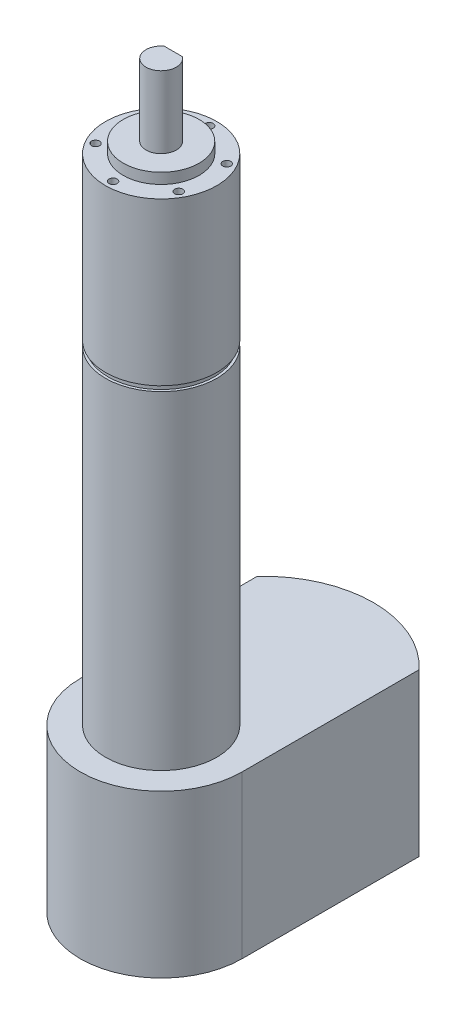
ISO-10303-21;
HEADER;
FILE_DESCRIPTION(('STEP AP214'),'2;1');
FILE_NAME('part.step','',(''),(''),'','','');
FILE_SCHEMA(('AUTOMOTIVE_DESIGN { 1 0 10303 214 1 1 1 1 }'));
ENDSEC;
DATA;
#1=APPLICATION_CONTEXT('core data for automotive mechanical design processes');
#2=APPLICATION_PROTOCOL_DEFINITION('international standard','automotive_design',2000,#1);
#3=PRODUCT_CONTEXT('',#1,'mechanical');
#4=PRODUCT('Part','Part','',(#3));
#5=PRODUCT_RELATED_PRODUCT_CATEGORY('part','',(#4));
#6=PRODUCT_DEFINITION_FORMATION('','',#4);
#7=PRODUCT_DEFINITION_CONTEXT('part definition',#1,'design');
#8=PRODUCT_DEFINITION('design','',#6,#7);
#9=PRODUCT_DEFINITION_SHAPE('','',#8);
#10=(LENGTH_UNIT() NAMED_UNIT(*) SI_UNIT(.MILLI.,.METRE.));
#11=(NAMED_UNIT(*) PLANE_ANGLE_UNIT() SI_UNIT($,.RADIAN.));
#12=(NAMED_UNIT(*) SI_UNIT($,.STERADIAN.) SOLID_ANGLE_UNIT());
#13=UNCERTAINTY_MEASURE_WITH_UNIT(LENGTH_MEASURE(1.E-05),#10,'distance_accuracy_value','');
#14=(GEOMETRIC_REPRESENTATION_CONTEXT(3) GLOBAL_UNCERTAINTY_ASSIGNED_CONTEXT((#13)) GLOBAL_UNIT_ASSIGNED_CONTEXT((#10,
#11,#12)) REPRESENTATION_CONTEXT('',''));
#15=CARTESIAN_POINT('',(0.,0.,0.));
#16=DIRECTION('',(0.,0.,1.));
#17=DIRECTION('',(1.,0.,0.));
#18=AXIS2_PLACEMENT_3D('',#15,#16,#17);
#19=CARTESIAN_POINT('',(11.,64.9,0.));
#20=DIRECTION('',(0.,-1.,0.));
#21=DIRECTION('',(0.,0.,-1.));
#22=AXIS2_PLACEMENT_3D('',#19,#20,#21);
#23=PLANE('',#22);
#24=CARTESIAN_POINT('',(0.,64.9,0.));
#25=DIRECTION('',(0.,1.,0.));
#26=DIRECTION('',(0.,0.,1.));
#27=AXIS2_PLACEMENT_3D('',#24,#25,#26);
#28=CIRCLE('',#27,10.5);
#29=CARTESIAN_POINT('',(0.,64.9,10.5));
#30=VERTEX_POINT('',#29);
#31=EDGE_CURVE('E203',#30,#30,#28,.T.);
#32=ORIENTED_EDGE('',*,*,#31,.F.);
#33=EDGE_LOOP('',(#32));
#34=FACE_BOUND('',#33,.T.);
#35=CARTESIAN_POINT('',(0.,64.9,0.));
#36=DIRECTION('',(0.,1.,0.));
#37=DIRECTION('',(0.,0.,1.));
#38=AXIS2_PLACEMENT_3D('',#35,#36,#37);
#39=CIRCLE('',#38,11.);
#40=CARTESIAN_POINT('',(0.,64.9,11.));
#41=VERTEX_POINT('',#40);
#42=EDGE_CURVE('E11',#41,#41,#39,.T.);
#43=ORIENTED_EDGE('',*,*,#42,.T.);
#44=EDGE_LOOP('',(#43));
#45=FACE_BOUND('',#44,.T.);
#46=ADVANCED_FACE('F40',(#34,#45),#23,.F.);
#47=CARTESIAN_POINT('',(0.,60.6506719839022,0.));
#48=DIRECTION('',(0.,1.,0.));
#49=DIRECTION('',(0.,0.,1.));
#50=AXIS2_PLACEMENT_3D('',#47,#48,#49);
#51=CYLINDRICAL_SURFACE('',#50,11.);
#52=ORIENTED_EDGE('',*,*,#42,.F.);
#53=EDGE_LOOP('',(#52));
#54=FACE_BOUND('',#53,.T.);
#55=CARTESIAN_POINT('',(0.,0.,0.));
#56=DIRECTION('',(0.,1.,0.));
#57=DIRECTION('',(0.,0.,1.));
#58=AXIS2_PLACEMENT_3D('',#55,#56,#57);
#59=CIRCLE('',#58,11.);
#60=CARTESIAN_POINT('',(0.,0.,11.));
#61=VERTEX_POINT('',#60);
#62=EDGE_CURVE('E195',#61,#61,#59,.T.);
#63=ORIENTED_EDGE('',*,*,#62,.T.);
#64=EDGE_LOOP('',(#63));
#65=FACE_BOUND('',#64,.T.);
#66=ADVANCED_FACE('F229',(#54,#65),#51,.T.);
#67=CARTESIAN_POINT('',(3.,114.2,0.));
#68=DIRECTION('',(0.,-1.,0.));
#69=DIRECTION('',(0.,0.,-1.));
#70=AXIS2_PLACEMENT_3D('',#67,#68,#69);
#71=PLANE('',#70);
#72=CARTESIAN_POINT('',(0.,114.2,0.));
#73=DIRECTION('',(0.,1.,0.));
#74=DIRECTION('',(0.,0.,1.));
#75=AXIS2_PLACEMENT_3D('',#72,#73,#74);
#76=CIRCLE('',#75,3.);
#77=CARTESIAN_POINT('',(-1.79999999999998,114.2,-2.40000000000001));
#78=VERTEX_POINT('',#77);
#79=CARTESIAN_POINT('',(1.79999999999998,114.2,-2.40000000000001));
#80=VERTEX_POINT('',#79);
#81=EDGE_CURVE('E47',#78,#80,#76,.T.);
#82=ORIENTED_EDGE('',*,*,#81,.T.);
#83=DIRECTION('',(1.,0.,0.));
#84=VECTOR('',#83,1.);
#85=CARTESIAN_POINT('',(0.,114.2,-2.40000000000001));
#86=LINE('',#85,#84);
#87=EDGE_CURVE('E197',#78,#80,#86,.T.);
#88=ORIENTED_EDGE('',*,*,#87,.F.);
#89=EDGE_LOOP('',(#82,#88));
#90=FACE_BOUND('',#89,.T.);
#91=ADVANCED_FACE('F260',(#90),#71,.F.);
#92=CARTESIAN_POINT('',(0.,60.6506719839022,0.));
#93=DIRECTION('',(0.,1.,0.));
#94=DIRECTION('',(0.,0.,1.));
#95=AXIS2_PLACEMENT_3D('',#92,#93,#94);
#96=CYLINDRICAL_SURFACE('',#95,3.);
#97=CARTESIAN_POINT('',(0.,104.,0.));
#98=DIRECTION('',(0.,1.,0.));
#99=DIRECTION('',(0.,0.,1.));
#100=AXIS2_PLACEMENT_3D('',#97,#98,#99);
#101=CIRCLE('',#100,3.);
#102=CARTESIAN_POINT('',(1.79999999999999,104.,-2.40000000000001));
#103=VERTEX_POINT('',#102);
#104=CARTESIAN_POINT('',(-1.79999999999998,104.,-2.40000000000001));
#105=VERTEX_POINT('',#104);
#106=EDGE_CURVE('E58',#103,#105,#101,.T.);
#107=ORIENTED_EDGE('',*,*,#106,.F.);
#108=DIRECTION('',(0.,1.,0.));
#109=VECTOR('',#108,1.);
#110=CARTESIAN_POINT('',(1.79999999999998,104.,-2.40000000000001));
#111=LINE('',#110,#109);
#112=EDGE_CURVE('E200',#103,#80,#111,.T.);
#113=ORIENTED_EDGE('',*,*,#112,.T.);
#114=ORIENTED_EDGE('',*,*,#81,.F.);
#115=DIRECTION('',(0.,1.,0.));
#116=VECTOR('',#115,1.);
#117=CARTESIAN_POINT('',(-1.79999999999998,104.,-2.40000000000001));
#118=LINE('',#117,#116);
#119=EDGE_CURVE('E69',#105,#78,#118,.T.);
#120=ORIENTED_EDGE('',*,*,#119,.F.);
#121=EDGE_LOOP('',(#107,#113,#114,#120));
#122=FACE_BOUND('',#121,.T.);
#123=CARTESIAN_POINT('',(0.,100.,0.));
#124=DIRECTION('',(0.,1.,0.));
#125=DIRECTION('',(0.,0.,1.));
#126=AXIS2_PLACEMENT_3D('',#123,#124,#125);
#127=CIRCLE('',#126,3.);
#128=CARTESIAN_POINT('',(0.,100.,3.));
#129=VERTEX_POINT('',#128);
#130=EDGE_CURVE('E222',#129,#129,#127,.T.);
#131=ORIENTED_EDGE('',*,*,#130,.T.);
#132=EDGE_LOOP('',(#131));
#133=FACE_BOUND('',#132,.T.);
#134=ADVANCED_FACE('F297',(#122,#133),#96,.T.);
#135=CARTESIAN_POINT('',(7.5,100.,0.));
#136=DIRECTION('',(0.,-1.,0.));
#137=DIRECTION('',(0.,0.,-1.));
#138=AXIS2_PLACEMENT_3D('',#135,#136,#137);
#139=PLANE('',#138);
#140=ORIENTED_EDGE('',*,*,#130,.F.);
#141=EDGE_LOOP('',(#140));
#142=FACE_BOUND('',#141,.T.);
#143=CARTESIAN_POINT('',(0.,100.,0.));
#144=DIRECTION('',(0.,1.,0.));
#145=DIRECTION('',(0.,0.,1.));
#146=AXIS2_PLACEMENT_3D('',#143,#144,#145);
#147=CIRCLE('',#146,7.5);
#148=CARTESIAN_POINT('',(0.,100.,7.5));
#149=VERTEX_POINT('',#148);
#150=EDGE_CURVE('E219',#149,#149,#147,.T.);
#151=ORIENTED_EDGE('',*,*,#150,.T.);
#152=EDGE_LOOP('',(#151));
#153=FACE_BOUND('',#152,.T.);
#154=ADVANCED_FACE('F293',(#142,#153),#139,.F.);
#155=CARTESIAN_POINT('',(0.,60.6506719839022,0.));
#156=DIRECTION('',(0.,1.,0.));
#157=DIRECTION('',(0.,0.,1.));
#158=AXIS2_PLACEMENT_3D('',#155,#156,#157);
#159=CYLINDRICAL_SURFACE('',#158,7.5);
#160=ORIENTED_EDGE('',*,*,#150,.F.);
#161=EDGE_LOOP('',(#160));
#162=FACE_BOUND('',#161,.T.);
#163=CARTESIAN_POINT('',(0.,97.9,0.));
#164=DIRECTION('',(0.,1.,0.));
#165=DIRECTION('',(0.,0.,1.));
#166=AXIS2_PLACEMENT_3D('',#163,#164,#165);
#167=CIRCLE('',#166,7.5);
#168=CARTESIAN_POINT('',(0.,97.9,7.5));
#169=VERTEX_POINT('',#168);
#170=EDGE_CURVE('E216',#169,#169,#167,.T.);
#171=ORIENTED_EDGE('',*,*,#170,.T.);
#172=EDGE_LOOP('',(#171));
#173=FACE_BOUND('',#172,.T.);
#174=ADVANCED_FACE('F289',(#162,#173),#159,.T.);
#175=CARTESIAN_POINT('',(11.,97.9,0.));
#176=DIRECTION('',(0.,-1.,0.));
#177=DIRECTION('',(0.,0.,-1.));
#178=AXIS2_PLACEMENT_3D('',#175,#176,#177);
#179=PLANE('',#178);
#180=CARTESIAN_POINT('',(0.,97.9,-9.5));
#181=DIRECTION('',(0.,1.,0.));
#182=DIRECTION('',(0.,0.,1.));
#183=AXIS2_PLACEMENT_3D('',#180,#181,#182);
#184=CIRCLE('',#183,0.799999999999999);
#185=CARTESIAN_POINT('',(0.,97.9,-8.7));
#186=VERTEX_POINT('',#185);
#187=EDGE_CURVE('E140',#186,#186,#184,.T.);
#188=ORIENTED_EDGE('',*,*,#187,.F.);
#189=EDGE_LOOP('',(#188));
#190=FACE_BOUND('',#189,.T.);
#191=CARTESIAN_POINT('',(-8.22724133595217,97.9,-4.75));
#192=DIRECTION('',(0.,1.,0.));
#193=DIRECTION('',(0.,0.,1.));
#194=AXIS2_PLACEMENT_3D('',#191,#192,#193);
#195=CIRCLE('',#194,0.799999999999999);
#196=CARTESIAN_POINT('',(-8.22724133595217,97.9,-3.95));
#197=VERTEX_POINT('',#196);
#198=EDGE_CURVE('E139',#197,#197,#195,.T.);
#199=ORIENTED_EDGE('',*,*,#198,.F.);
#200=EDGE_LOOP('',(#199));
#201=FACE_BOUND('',#200,.T.);
#202=CARTESIAN_POINT('',(-8.22724133595217,97.9,4.75));
#203=DIRECTION('',(0.,1.,0.));
#204=DIRECTION('',(0.,0.,1.));
#205=AXIS2_PLACEMENT_3D('',#202,#203,#204);
#206=CIRCLE('',#205,0.799999999999999);
#207=CARTESIAN_POINT('',(-8.22724133595217,97.9,5.55));
#208=VERTEX_POINT('',#207);
#209=EDGE_CURVE('E150',#208,#208,#206,.T.);
#210=ORIENTED_EDGE('',*,*,#209,.F.);
#211=EDGE_LOOP('',(#210));
#212=FACE_BOUND('',#211,.T.);
#213=CARTESIAN_POINT('',(0.,97.9,9.5));
#214=DIRECTION('',(0.,1.,0.));
#215=DIRECTION('',(0.,0.,1.));
#216=AXIS2_PLACEMENT_3D('',#213,#214,#215);
#217=CIRCLE('',#216,0.799999999999999);
#218=CARTESIAN_POINT('',(0.,97.9,10.3));
#219=VERTEX_POINT('',#218);
#220=EDGE_CURVE('E156',#219,#219,#217,.T.);
#221=ORIENTED_EDGE('',*,*,#220,.F.);
#222=EDGE_LOOP('',(#221));
#223=FACE_BOUND('',#222,.T.);
#224=CARTESIAN_POINT('',(8.22724133595217,97.9,4.75));
#225=DIRECTION('',(0.,1.,0.));
#226=DIRECTION('',(0.,0.,1.));
#227=AXIS2_PLACEMENT_3D('',#224,#225,#226);
#228=CIRCLE('',#227,0.799999999999999);
#229=CARTESIAN_POINT('',(8.22724133595217,97.9,5.55));
#230=VERTEX_POINT('',#229);
#231=EDGE_CURVE('E162',#230,#230,#228,.T.);
#232=ORIENTED_EDGE('',*,*,#231,.F.);
#233=EDGE_LOOP('',(#232));
#234=FACE_BOUND('',#233,.T.);
#235=CARTESIAN_POINT('',(8.22724133595217,97.9,-4.75));
#236=DIRECTION('',(0.,1.,0.));
#237=DIRECTION('',(0.,0.,1.));
#238=AXIS2_PLACEMENT_3D('',#235,#236,#237);
#239=CIRCLE('',#238,0.799999999999999);
#240=CARTESIAN_POINT('',(8.22724133595217,97.9,-3.95));
#241=VERTEX_POINT('',#240);
#242=EDGE_CURVE('E168',#241,#241,#239,.T.);
#243=ORIENTED_EDGE('',*,*,#242,.F.);
#244=EDGE_LOOP('',(#243));
#245=FACE_BOUND('',#244,.T.);
#246=ORIENTED_EDGE('',*,*,#170,.F.);
#247=EDGE_LOOP('',(#246));
#248=FACE_BOUND('',#247,.T.);
#249=CARTESIAN_POINT('',(0.,97.9,0.));
#250=DIRECTION('',(0.,1.,0.));
#251=DIRECTION('',(0.,0.,1.));
#252=AXIS2_PLACEMENT_3D('',#249,#250,#251);
#253=CIRCLE('',#252,11.);
#254=CARTESIAN_POINT('',(0.,97.9,11.));
#255=VERTEX_POINT('',#254);
#256=EDGE_CURVE('E213',#255,#255,#253,.T.);
#257=ORIENTED_EDGE('',*,*,#256,.T.);
#258=EDGE_LOOP('',(#257));
#259=FACE_BOUND('',#258,.T.);
#260=ADVANCED_FACE('F285',(#190,#201,#212,#223,#234,#245,#248,#259),#179,.F.);
#261=CARTESIAN_POINT('',(0.,60.6506719839022,0.));
#262=DIRECTION('',(0.,1.,0.));
#263=DIRECTION('',(0.,0.,1.));
#264=AXIS2_PLACEMENT_3D('',#261,#262,#263);
#265=CYLINDRICAL_SURFACE('',#264,11.);
#266=ORIENTED_EDGE('',*,*,#256,.F.);
#267=EDGE_LOOP('',(#266));
#268=FACE_BOUND('',#267,.T.);
#269=CARTESIAN_POINT('',(0.,65.9,0.));
#270=DIRECTION('',(0.,1.,0.));
#271=DIRECTION('',(0.,0.,1.));
#272=AXIS2_PLACEMENT_3D('',#269,#270,#271);
#273=CIRCLE('',#272,11.);
#274=CARTESIAN_POINT('',(0.,65.9,11.));
#275=VERTEX_POINT('',#274);
#276=EDGE_CURVE('E210',#275,#275,#273,.T.);
#277=ORIENTED_EDGE('',*,*,#276,.T.);
#278=EDGE_LOOP('',(#277));
#279=FACE_BOUND('',#278,.T.);
#280=ADVANCED_FACE('F277',(#268,#279),#265,.T.);
#281=CARTESIAN_POINT('',(10.5,65.9,0.));
#282=DIRECTION('',(0.,1.,0.));
#283=DIRECTION('',(0.,0.,1.));
#284=AXIS2_PLACEMENT_3D('',#281,#282,#283);
#285=PLANE('',#284);
#286=ORIENTED_EDGE('',*,*,#276,.F.);
#287=EDGE_LOOP('',(#286));
#288=FACE_BOUND('',#287,.T.);
#289=CARTESIAN_POINT('',(0.,65.9,0.));
#290=DIRECTION('',(0.,1.,0.));
#291=DIRECTION('',(0.,0.,1.));
#292=AXIS2_PLACEMENT_3D('',#289,#290,#291);
#293=CIRCLE('',#292,10.5);
#294=CARTESIAN_POINT('',(0.,65.9,10.5));
#295=VERTEX_POINT('',#294);
#296=EDGE_CURVE('E207',#295,#295,#293,.T.);
#297=ORIENTED_EDGE('',*,*,#296,.T.);
#298=EDGE_LOOP('',(#297));
#299=FACE_BOUND('',#298,.T.);
#300=ADVANCED_FACE('F269',(#288,#299),#285,.F.);
#301=CARTESIAN_POINT('',(0.,60.6506719839022,0.));
#302=DIRECTION('',(0.,1.,0.));
#303=DIRECTION('',(0.,0.,1.));
#304=AXIS2_PLACEMENT_3D('',#301,#302,#303);
#305=CYLINDRICAL_SURFACE('',#304,10.5);
#306=ORIENTED_EDGE('',*,*,#296,.F.);
#307=EDGE_LOOP('',(#306));
#308=FACE_BOUND('',#307,.T.);
#309=ORIENTED_EDGE('',*,*,#31,.T.);
#310=EDGE_LOOP('',(#309));
#311=FACE_BOUND('',#310,.T.);
#312=ADVANCED_FACE('F266',(#308,#311),#305,.T.);
#313=CARTESIAN_POINT('',(0.,104.,-2.40000000000001));
#314=DIRECTION('',(0.,0.,1.));
#315=DIRECTION('',(1.,0.,0.));
#316=AXIS2_PLACEMENT_3D('',#313,#314,#315);
#317=PLANE('',#316);
#318=ORIENTED_EDGE('',*,*,#87,.T.);
#319=ORIENTED_EDGE('',*,*,#112,.F.);
#320=DIRECTION('',(1.,0.,0.));
#321=VECTOR('',#320,1.);
#322=CARTESIAN_POINT('',(0.,104.,-2.40000000000001));
#323=LINE('',#322,#321);
#324=EDGE_CURVE('E53',#105,#103,#323,.T.);
#325=ORIENTED_EDGE('',*,*,#324,.F.);
#326=ORIENTED_EDGE('',*,*,#119,.T.);
#327=EDGE_LOOP('',(#318,#319,#325,#326));
#328=FACE_BOUND('',#327,.T.);
#329=ADVANCED_FACE('F268',(#328),#317,.F.);
#330=CARTESIAN_POINT('',(0.,104.,0.));
#331=DIRECTION('',(0.,1.,0.));
#332=DIRECTION('',(0.,0.,1.));
#333=AXIS2_PLACEMENT_3D('',#330,#331,#332);
#334=PLANE('',#333);
#335=ORIENTED_EDGE('',*,*,#106,.T.);
#336=ORIENTED_EDGE('',*,*,#324,.T.);
#337=EDGE_LOOP('',(#335,#336));
#338=FACE_BOUND('',#337,.T.);
#339=ADVANCED_FACE('F253',(#338),#334,.T.);
#340=CARTESIAN_POINT('',(0.,-32.,0.));
#341=DIRECTION('',(0.,1.,0.));
#342=DIRECTION('',(0.,0.,1.));
#343=AXIS2_PLACEMENT_3D('',#340,#341,#342);
#344=CYLINDRICAL_SURFACE('',#343,16.);
#345=CARTESIAN_POINT('',(0.,0.,0.));
#346=DIRECTION('',(0.,-1.,0.));
#347=DIRECTION('',(0.,0.,-1.));
#348=AXIS2_PLACEMENT_3D('',#345,#346,#347);
#349=CIRCLE('',#348,16.);
#350=CARTESIAN_POINT('',(16.,0.,0.));
#351=VERTEX_POINT('',#350);
#352=CARTESIAN_POINT('',(-16.,0.,0.));
#353=VERTEX_POINT('',#352);
#354=EDGE_CURVE('E174',#351,#353,#349,.T.);
#355=ORIENTED_EDGE('',*,*,#354,.T.);
#356=DIRECTION('',(0.,1.,0.));
#357=VECTOR('',#356,1.);
#358=CARTESIAN_POINT('',(-16.,-32.,0.));
#359=LINE('',#358,#357);
#360=CARTESIAN_POINT('',(-16.,-32.,0.));
#361=VERTEX_POINT('',#360);
#362=EDGE_CURVE('E193',#361,#353,#359,.T.);
#363=ORIENTED_EDGE('',*,*,#362,.F.);
#364=CARTESIAN_POINT('',(0.,-32.,0.));
#365=DIRECTION('',(0.,-1.,0.));
#366=DIRECTION('',(0.,0.,-1.));
#367=AXIS2_PLACEMENT_3D('',#364,#365,#366);
#368=CIRCLE('',#367,16.);
#369=CARTESIAN_POINT('',(16.,-32.,0.));
#370=VERTEX_POINT('',#369);
#371=EDGE_CURVE('E175',#370,#361,#368,.T.);
#372=ORIENTED_EDGE('',*,*,#371,.F.);
#373=DIRECTION('',(0.,1.,0.));
#374=VECTOR('',#373,1.);
#375=CARTESIAN_POINT('',(16.,-32.,0.));
#376=LINE('',#375,#374);
#377=EDGE_CURVE('E181',#370,#351,#376,.T.);
#378=ORIENTED_EDGE('',*,*,#377,.T.);
#379=EDGE_LOOP('',(#355,#363,#372,#378));
#380=FACE_BOUND('',#379,.T.);
#381=ADVANCED_FACE('F240',(#380),#344,.T.);
#382=CARTESIAN_POINT('',(-16.,-32.,0.));
#383=DIRECTION('',(1.,0.,0.));
#384=DIRECTION('',(0.,0.,-1.));
#385=AXIS2_PLACEMENT_3D('',#382,#383,#384);
#386=PLANE('',#385);
#387=DIRECTION('',(0.,0.,-1.));
#388=VECTOR('',#387,1.);
#389=CARTESIAN_POINT('',(-16.,0.,0.));
#390=LINE('',#389,#388);
#391=CARTESIAN_POINT('',(-16.,0.,-35.));
#392=VERTEX_POINT('',#391);
#393=EDGE_CURVE('E184',#353,#392,#390,.T.);
#394=ORIENTED_EDGE('',*,*,#393,.T.);
#395=DIRECTION('',(0.,1.,0.));
#396=VECTOR('',#395,1.);
#397=CARTESIAN_POINT('',(-16.,-32.,-35.));
#398=LINE('',#397,#396);
#399=CARTESIAN_POINT('',(-16.,-32.,-35.));
#400=VERTEX_POINT('',#399);
#401=EDGE_CURVE('E191',#400,#392,#398,.T.);
#402=ORIENTED_EDGE('',*,*,#401,.F.);
#403=DIRECTION('',(0.,0.,-1.));
#404=VECTOR('',#403,1.);
#405=CARTESIAN_POINT('',(-16.,-32.,0.));
#406=LINE('',#405,#404);
#407=EDGE_CURVE('E110',#361,#400,#406,.T.);
#408=ORIENTED_EDGE('',*,*,#407,.F.);
#409=ORIENTED_EDGE('',*,*,#362,.T.);
#410=EDGE_LOOP('',(#394,#402,#408,#409));
#411=FACE_BOUND('',#410,.T.);
#412=ADVANCED_FACE('F245',(#411),#386,.F.);
#413=CARTESIAN_POINT('',(0.,-32.,-20.2142857142857));
#414=DIRECTION('',(0.,1.,0.));
#415=DIRECTION('',(0.,0.,1.));
#416=AXIS2_PLACEMENT_3D('',#413,#414,#415);
#417=CYLINDRICAL_SURFACE('',#416,21.7857142857143);
#418=CARTESIAN_POINT('',(0.,0.,-20.2142857142857));
#419=DIRECTION('',(0.,-1.,0.));
#420=DIRECTION('',(0.,0.,-1.));
#421=AXIS2_PLACEMENT_3D('',#418,#419,#420);
#422=CIRCLE('',#421,21.7857142857143);
#423=CARTESIAN_POINT('',(16.,0.,-35.));
#424=VERTEX_POINT('',#423);
#425=EDGE_CURVE('E96',#392,#424,#422,.T.);
#426=ORIENTED_EDGE('',*,*,#425,.T.);
#427=DIRECTION('',(0.,1.,0.));
#428=VECTOR('',#427,1.);
#429=CARTESIAN_POINT('',(16.,-32.,-35.));
#430=LINE('',#429,#428);
#431=CARTESIAN_POINT('',(16.,-32.,-35.));
#432=VERTEX_POINT('',#431);
#433=EDGE_CURVE('E189',#432,#424,#430,.T.);
#434=ORIENTED_EDGE('',*,*,#433,.F.);
#435=CARTESIAN_POINT('',(0.,-32.,-20.2142857142857));
#436=DIRECTION('',(0.,-1.,0.));
#437=DIRECTION('',(0.,0.,-1.));
#438=AXIS2_PLACEMENT_3D('',#435,#436,#437);
#439=CIRCLE('',#438,21.7857142857143);
#440=EDGE_CURVE('E178',#400,#432,#439,.T.);
#441=ORIENTED_EDGE('',*,*,#440,.F.);
#442=ORIENTED_EDGE('',*,*,#401,.T.);
#443=EDGE_LOOP('',(#426,#434,#441,#442));
#444=FACE_BOUND('',#443,.T.);
#445=ADVANCED_FACE('F244',(#444),#417,.T.);
#446=CARTESIAN_POINT('',(16.,-32.,0.));
#447=DIRECTION('',(-1.,0.,0.));
#448=DIRECTION('',(0.,0.,1.));
#449=AXIS2_PLACEMENT_3D('',#446,#447,#448);
#450=PLANE('',#449);
#451=DIRECTION('',(0.,0.,1.));
#452=VECTOR('',#451,1.);
#453=CARTESIAN_POINT('',(16.,0.,0.));
#454=LINE('',#453,#452);
#455=EDGE_CURVE('E102',#424,#351,#454,.T.);
#456=ORIENTED_EDGE('',*,*,#455,.T.);
#457=ORIENTED_EDGE('',*,*,#377,.F.);
#458=DIRECTION('',(0.,0.,1.));
#459=VECTOR('',#458,1.);
#460=CARTESIAN_POINT('',(16.,-32.,0.));
#461=LINE('',#460,#459);
#462=EDGE_CURVE('E78',#432,#370,#461,.T.);
#463=ORIENTED_EDGE('',*,*,#462,.F.);
#464=ORIENTED_EDGE('',*,*,#433,.T.);
#465=EDGE_LOOP('',(#456,#457,#463,#464));
#466=FACE_BOUND('',#465,.T.);
#467=ADVANCED_FACE('F242',(#466),#450,.F.);
#468=CARTESIAN_POINT('',(0.,-32.,0.));
#469=DIRECTION('',(0.,-1.,0.));
#470=DIRECTION('',(0.,0.,-1.));
#471=AXIS2_PLACEMENT_3D('',#468,#469,#470);
#472=PLANE('',#471);
#473=ORIENTED_EDGE('',*,*,#371,.T.);
#474=ORIENTED_EDGE('',*,*,#407,.T.);
#475=ORIENTED_EDGE('',*,*,#440,.T.);
#476=ORIENTED_EDGE('',*,*,#462,.T.);
#477=EDGE_LOOP('',(#473,#474,#475,#476));
#478=FACE_BOUND('',#477,.T.);
#479=ADVANCED_FACE('F235',(#478),#472,.T.);
#480=CARTESIAN_POINT('',(0.,0.,0.));
#481=DIRECTION('',(0.,-1.,0.));
#482=DIRECTION('',(0.,0.,-1.));
#483=AXIS2_PLACEMENT_3D('',#480,#481,#482);
#484=PLANE('',#483);
#485=ORIENTED_EDGE('',*,*,#62,.F.);
#486=EDGE_LOOP('',(#485));
#487=FACE_BOUND('',#486,.T.);
#488=ORIENTED_EDGE('',*,*,#354,.F.);
#489=ORIENTED_EDGE('',*,*,#455,.F.);
#490=ORIENTED_EDGE('',*,*,#425,.F.);
#491=ORIENTED_EDGE('',*,*,#393,.F.);
#492=EDGE_LOOP('',(#488,#489,#490,#491));
#493=FACE_BOUND('',#492,.T.);
#494=ADVANCED_FACE('F231',(#487,#493),#484,.F.);
#495=CARTESIAN_POINT('',(8.22724133595217,92.9,-4.75));
#496=DIRECTION('',(0.,1.,0.));
#497=DIRECTION('',(0.,0.,1.));
#498=AXIS2_PLACEMENT_3D('',#495,#496,#497);
#499=CONICAL_SURFACE('',#498,0.799999999999999,1.02974425867665);
#500=CARTESIAN_POINT('',(8.22724133595217,92.419311504778,-4.75));
#501=VERTEX_POINT('',#500);
#502=VERTEX_LOOP('',#501);
#503=FACE_BOUND('',#502,.T.);
#504=CARTESIAN_POINT('',(8.22724133595217,92.9,-4.75));
#505=DIRECTION('',(0.,1.,0.));
#506=DIRECTION('',(0.,0.,1.));
#507=AXIS2_PLACEMENT_3D('',#504,#505,#506);
#508=CIRCLE('',#507,0.799999999999999);
#509=CARTESIAN_POINT('',(8.22724133595217,92.9,-3.95));
#510=VERTEX_POINT('',#509);
#511=EDGE_CURVE('E171',#510,#510,#508,.T.);
#512=ORIENTED_EDGE('',*,*,#511,.T.);
#513=EDGE_LOOP('',(#512));
#514=FACE_BOUND('',#513,.T.);
#515=ADVANCED_FACE('F234',(#503,#514),#499,.F.);
#516=CARTESIAN_POINT('',(8.22724133595217,97.9,-4.75));
#517=DIRECTION('',(0.,1.,0.));
#518=DIRECTION('',(0.,0.,1.));
#519=AXIS2_PLACEMENT_3D('',#516,#517,#518);
#520=CYLINDRICAL_SURFACE('',#519,0.799999999999999);
#521=ORIENTED_EDGE('',*,*,#511,.F.);
#522=EDGE_LOOP('',(#521));
#523=FACE_BOUND('',#522,.T.);
#524=ORIENTED_EDGE('',*,*,#242,.T.);
#525=EDGE_LOOP('',(#524));
#526=FACE_BOUND('',#525,.T.);
#527=ADVANCED_FACE('F440',(#523,#526),#520,.F.);
#528=CARTESIAN_POINT('',(8.22724133595217,92.9,4.75));
#529=DIRECTION('',(0.,1.,0.));
#530=DIRECTION('',(0.,0.,1.));
#531=AXIS2_PLACEMENT_3D('',#528,#529,#530);
#532=CONICAL_SURFACE('',#531,0.799999999999999,1.02974425867665);
#533=CARTESIAN_POINT('',(8.22724133595217,92.419311504778,4.75));
#534=VERTEX_POINT('',#533);
#535=VERTEX_LOOP('',#534);
#536=FACE_BOUND('',#535,.T.);
#537=CARTESIAN_POINT('',(8.22724133595217,92.9,4.75));
#538=DIRECTION('',(0.,1.,0.));
#539=DIRECTION('',(0.,0.,1.));
#540=AXIS2_PLACEMENT_3D('',#537,#538,#539);
#541=CIRCLE('',#540,0.799999999999999);
#542=CARTESIAN_POINT('',(8.22724133595217,92.9,5.55));
#543=VERTEX_POINT('',#542);
#544=EDGE_CURVE('E165',#543,#543,#541,.T.);
#545=ORIENTED_EDGE('',*,*,#544,.T.);
#546=EDGE_LOOP('',(#545));
#547=FACE_BOUND('',#546,.T.);
#548=ADVANCED_FACE('F449',(#536,#547),#532,.F.);
#549=CARTESIAN_POINT('',(8.22724133595217,97.9,4.75));
#550=DIRECTION('',(0.,1.,0.));
#551=DIRECTION('',(0.,0.,1.));
#552=AXIS2_PLACEMENT_3D('',#549,#550,#551);
#553=CYLINDRICAL_SURFACE('',#552,0.799999999999999);
#554=ORIENTED_EDGE('',*,*,#544,.F.);
#555=EDGE_LOOP('',(#554));
#556=FACE_BOUND('',#555,.T.);
#557=ORIENTED_EDGE('',*,*,#231,.T.);
#558=EDGE_LOOP('',(#557));
#559=FACE_BOUND('',#558,.T.);
#560=ADVANCED_FACE('F459',(#556,#559),#553,.F.);
#561=CARTESIAN_POINT('',(0.,92.9,9.5));
#562=DIRECTION('',(0.,1.,0.));
#563=DIRECTION('',(0.,0.,1.));
#564=AXIS2_PLACEMENT_3D('',#561,#562,#563);
#565=CONICAL_SURFACE('',#564,0.799999999999999,1.02974425867665);
#566=CARTESIAN_POINT('',(0.,92.419311504778,9.5));
#567=VERTEX_POINT('',#566);
#568=VERTEX_LOOP('',#567);
#569=FACE_BOUND('',#568,.T.);
#570=CARTESIAN_POINT('',(0.,92.9,9.5));
#571=DIRECTION('',(0.,1.,0.));
#572=DIRECTION('',(0.,0.,1.));
#573=AXIS2_PLACEMENT_3D('',#570,#571,#572);
#574=CIRCLE('',#573,0.799999999999999);
#575=CARTESIAN_POINT('',(0.,92.9,10.3));
#576=VERTEX_POINT('',#575);
#577=EDGE_CURVE('E159',#576,#576,#574,.T.);
#578=ORIENTED_EDGE('',*,*,#577,.T.);
#579=EDGE_LOOP('',(#578));
#580=FACE_BOUND('',#579,.T.);
#581=ADVANCED_FACE('F467',(#569,#580),#565,.F.);
#582=CARTESIAN_POINT('',(0.,97.9,9.5));
#583=DIRECTION('',(0.,1.,0.));
#584=DIRECTION('',(0.,0.,1.));
#585=AXIS2_PLACEMENT_3D('',#582,#583,#584);
#586=CYLINDRICAL_SURFACE('',#585,0.799999999999999);
#587=ORIENTED_EDGE('',*,*,#577,.F.);
#588=EDGE_LOOP('',(#587));
#589=FACE_BOUND('',#588,.T.);
#590=ORIENTED_EDGE('',*,*,#220,.T.);
#591=EDGE_LOOP('',(#590));
#592=FACE_BOUND('',#591,.T.);
#593=ADVANCED_FACE('F477',(#589,#592),#586,.F.);
#594=CARTESIAN_POINT('',(-8.22724133595217,92.9,4.75));
#595=DIRECTION('',(0.,1.,0.));
#596=DIRECTION('',(0.,0.,1.));
#597=AXIS2_PLACEMENT_3D('',#594,#595,#596);
#598=CONICAL_SURFACE('',#597,0.799999999999999,1.02974425867665);
#599=CARTESIAN_POINT('',(-8.22724133595217,92.419311504778,4.75));
#600=VERTEX_POINT('',#599);
#601=VERTEX_LOOP('',#600);
#602=FACE_BOUND('',#601,.T.);
#603=CARTESIAN_POINT('',(-8.22724133595217,92.9,4.75));
#604=DIRECTION('',(0.,1.,0.));
#605=DIRECTION('',(0.,0.,1.));
#606=AXIS2_PLACEMENT_3D('',#603,#604,#605);
#607=CIRCLE('',#606,0.799999999999999);
#608=CARTESIAN_POINT('',(-8.22724133595217,92.9,5.55));
#609=VERTEX_POINT('',#608);
#610=EDGE_CURVE('E153',#609,#609,#607,.T.);
#611=ORIENTED_EDGE('',*,*,#610,.T.);
#612=EDGE_LOOP('',(#611));
#613=FACE_BOUND('',#612,.T.);
#614=ADVANCED_FACE('F485',(#602,#613),#598,.F.);
#615=CARTESIAN_POINT('',(-8.22724133595217,97.9,4.75));
#616=DIRECTION('',(0.,1.,0.));
#617=DIRECTION('',(0.,0.,1.));
#618=AXIS2_PLACEMENT_3D('',#615,#616,#617);
#619=CYLINDRICAL_SURFACE('',#618,0.799999999999999);
#620=ORIENTED_EDGE('',*,*,#610,.F.);
#621=EDGE_LOOP('',(#620));
#622=FACE_BOUND('',#621,.T.);
#623=ORIENTED_EDGE('',*,*,#209,.T.);
#624=EDGE_LOOP('',(#623));
#625=FACE_BOUND('',#624,.T.);
#626=ADVANCED_FACE('F495',(#622,#625),#619,.F.);
#627=CARTESIAN_POINT('',(-8.22724133595217,92.9,-4.75));
#628=DIRECTION('',(0.,1.,0.));
#629=DIRECTION('',(0.,0.,1.));
#630=AXIS2_PLACEMENT_3D('',#627,#628,#629);
#631=CONICAL_SURFACE('',#630,0.799999999999999,1.02974425867665);
#632=CARTESIAN_POINT('',(-8.22724133595217,92.419311504778,-4.75));
#633=VERTEX_POINT('',#632);
#634=VERTEX_LOOP('',#633);
#635=FACE_BOUND('',#634,.T.);
#636=CARTESIAN_POINT('',(-8.22724133595217,92.9,-4.75));
#637=DIRECTION('',(0.,1.,0.));
#638=DIRECTION('',(0.,0.,1.));
#639=AXIS2_PLACEMENT_3D('',#636,#637,#638);
#640=CIRCLE('',#639,0.799999999999999);
#641=CARTESIAN_POINT('',(-8.22724133595217,92.9,-3.95));
#642=VERTEX_POINT('',#641);
#643=EDGE_CURVE('E143',#642,#642,#640,.T.);
#644=ORIENTED_EDGE('',*,*,#643,.T.);
#645=EDGE_LOOP('',(#644));
#646=FACE_BOUND('',#645,.T.);
#647=ADVANCED_FACE('F503',(#635,#646),#631,.F.);
#648=CARTESIAN_POINT('',(-8.22724133595217,97.9,-4.75));
#649=DIRECTION('',(0.,1.,0.));
#650=DIRECTION('',(0.,0.,1.));
#651=AXIS2_PLACEMENT_3D('',#648,#649,#650);
#652=CYLINDRICAL_SURFACE('',#651,0.799999999999999);
#653=ORIENTED_EDGE('',*,*,#643,.F.);
#654=EDGE_LOOP('',(#653));
#655=FACE_BOUND('',#654,.T.);
#656=ORIENTED_EDGE('',*,*,#198,.T.);
#657=EDGE_LOOP('',(#656));
#658=FACE_BOUND('',#657,.T.);
#659=ADVANCED_FACE('F133',(#655,#658),#652,.F.);
#660=CARTESIAN_POINT('',(0.,92.9,-9.5));
#661=DIRECTION('',(0.,1.,0.));
#662=DIRECTION('',(0.,0.,1.));
#663=AXIS2_PLACEMENT_3D('',#660,#661,#662);
#664=CONICAL_SURFACE('',#663,0.799999999999999,1.02974425867665);
#665=CARTESIAN_POINT('',(0.,92.419311504778,-9.5));
#666=VERTEX_POINT('',#665);
#667=VERTEX_LOOP('',#666);
#668=FACE_BOUND('',#667,.T.);
#669=CARTESIAN_POINT('',(0.,92.9,-9.5));
#670=DIRECTION('',(0.,1.,0.));
#671=DIRECTION('',(0.,0.,1.));
#672=AXIS2_PLACEMENT_3D('',#669,#670,#671);
#673=CIRCLE('',#672,0.799999999999999);
#674=CARTESIAN_POINT('',(0.,92.9,-8.7));
#675=VERTEX_POINT('',#674);
#676=EDGE_CURVE('E137',#675,#675,#673,.T.);
#677=ORIENTED_EDGE('',*,*,#676,.T.);
#678=EDGE_LOOP('',(#677));
#679=FACE_BOUND('',#678,.T.);
#680=ADVANCED_FACE('F129',(#668,#679),#664,.F.);
#681=CARTESIAN_POINT('',(0.,97.9,-9.5));
#682=DIRECTION('',(0.,1.,0.));
#683=DIRECTION('',(0.,0.,1.));
#684=AXIS2_PLACEMENT_3D('',#681,#682,#683);
#685=CYLINDRICAL_SURFACE('',#684,0.799999999999999);
#686=ORIENTED_EDGE('',*,*,#676,.F.);
#687=EDGE_LOOP('',(#686));
#688=FACE_BOUND('',#687,.T.);
#689=ORIENTED_EDGE('',*,*,#187,.T.);
#690=EDGE_LOOP('',(#689));
#691=FACE_BOUND('',#690,.T.);
#692=ADVANCED_FACE('F132',(#688,#691),#685,.F.);
#693=CLOSED_SHELL('',(#46,#66,#91,#134,#154,#174,#260,#280,#300,#312,#329,#339,#381,#412,#445,
#467,#479,#494,#515,#527,#548,#560,#581,#593,#614,#626,#647,#659,#680,#692));
#694=MANIFOLD_SOLID_BREP('B2',#693);
#695=ADVANCED_BREP_SHAPE_REPRESENTATION('',(#18,#694),#14);
#696=SHAPE_DEFINITION_REPRESENTATION(#9,#695);
ENDSEC;
END-ISO-10303-21;
